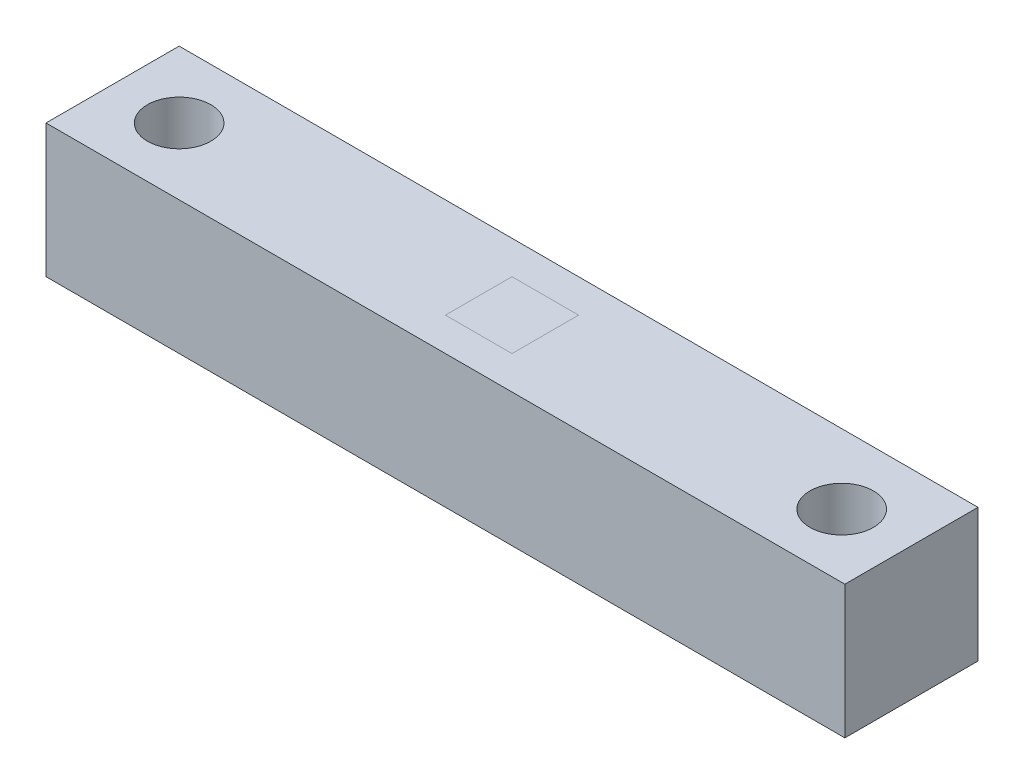
ISO-10303-21;
HEADER;
FILE_DESCRIPTION(('STEP AP214'),'2;1');
FILE_NAME('part.step','',(''),(''),'','','');
FILE_SCHEMA(('AUTOMOTIVE_DESIGN { 1 0 10303 214 1 1 1 1 }'));
ENDSEC;
DATA;
#1=APPLICATION_CONTEXT('core data for automotive mechanical design processes');
#2=APPLICATION_PROTOCOL_DEFINITION('international standard','automotive_design',2000,#1);
#3=PRODUCT_CONTEXT('',#1,'mechanical');
#4=PRODUCT('Part','Part','',(#3));
#5=PRODUCT_RELATED_PRODUCT_CATEGORY('part','',(#4));
#6=PRODUCT_DEFINITION_FORMATION('','',#4);
#7=PRODUCT_DEFINITION_CONTEXT('part definition',#1,'design');
#8=PRODUCT_DEFINITION('design','',#6,#7);
#9=PRODUCT_DEFINITION_SHAPE('','',#8);
#10=(LENGTH_UNIT() NAMED_UNIT(*) SI_UNIT(.MILLI.,.METRE.));
#11=(NAMED_UNIT(*) PLANE_ANGLE_UNIT() SI_UNIT($,.RADIAN.));
#12=(NAMED_UNIT(*) SI_UNIT($,.STERADIAN.) SOLID_ANGLE_UNIT());
#13=UNCERTAINTY_MEASURE_WITH_UNIT(LENGTH_MEASURE(1.E-05),#10,'distance_accuracy_value','');
#14=(GEOMETRIC_REPRESENTATION_CONTEXT(3) GLOBAL_UNCERTAINTY_ASSIGNED_CONTEXT((#13)) GLOBAL_UNIT_ASSIGNED_CONTEXT((#10,
#11,#12)) REPRESENTATION_CONTEXT('',''));
#15=CARTESIAN_POINT('',(0.,0.,0.));
#16=DIRECTION('',(0.,0.,1.));
#17=DIRECTION('',(1.,0.,0.));
#18=AXIS2_PLACEMENT_3D('',#15,#16,#17);
#19=CARTESIAN_POINT('',(120.,20.,40.));
#20=DIRECTION('',(0.,-1.,0.));
#21=DIRECTION('',(1.,0.,0.));
#22=AXIS2_PLACEMENT_3D('',#19,#20,#21);
#23=PLANE('',#22);
#24=DIRECTION('',(-1.,0.,0.));
#25=VECTOR('',#24,1.);
#26=CARTESIAN_POINT('',(120.,20.,0.));
#27=LINE('',#26,#25);
#28=CARTESIAN_POINT('',(120.,20.,0.));
#29=VERTEX_POINT('',#28);
#30=CARTESIAN_POINT('',(-120.,20.,0.));
#31=VERTEX_POINT('',#30);
#32=EDGE_CURVE('E261',#29,#31,#27,.T.);
#33=ORIENTED_EDGE('',*,*,#32,.T.);
#34=DIRECTION('',(0.,0.,-1.));
#35=VECTOR('',#34,1.);
#36=CARTESIAN_POINT('',(-120.,20.,40.));
#37=LINE('',#36,#35);
#38=CARTESIAN_POINT('',(-120.,20.,40.));
#39=VERTEX_POINT('',#38);
#40=EDGE_CURVE('E328',#39,#31,#37,.T.);
#41=ORIENTED_EDGE('',*,*,#40,.F.);
#42=DIRECTION('',(-1.,0.,0.));
#43=VECTOR('',#42,1.);
#44=CARTESIAN_POINT('',(120.,20.,40.));
#45=LINE('',#44,#43);
#46=CARTESIAN_POINT('',(120.,20.,40.));
#47=VERTEX_POINT('',#46);
#48=EDGE_CURVE('E258',#47,#39,#45,.T.);
#49=ORIENTED_EDGE('',*,*,#48,.F.);
#50=DIRECTION('',(0.,0.,-1.));
#51=VECTOR('',#50,1.);
#52=CARTESIAN_POINT('',(120.,20.,40.));
#53=LINE('',#52,#51);
#54=EDGE_CURVE('E272',#47,#29,#53,.T.);
#55=ORIENTED_EDGE('',*,*,#54,.T.);
#56=EDGE_LOOP('',(#33,#41,#49,#55));
#57=FACE_BOUND('',#56,.T.);
#58=CARTESIAN_POINT('',(100.,20.,20.95));
#59=DIRECTION('',(0.,1.,0.));
#60=DIRECTION('',(-1.,0.,0.));
#61=AXIS2_PLACEMENT_3D('',#58,#59,#60);
#62=CIRCLE('',#61,9.52500000000001);
#63=CARTESIAN_POINT('',(90.475,20.,20.95));
#64=VERTEX_POINT('',#63);
#65=EDGE_CURVE('E359',#64,#64,#62,.T.);
#66=ORIENTED_EDGE('',*,*,#65,.F.);
#67=EDGE_LOOP('',(#66));
#68=FACE_BOUND('',#67,.T.);
#69=CARTESIAN_POINT('',(-100.,20.,20.));
#70=DIRECTION('',(0.,1.,0.));
#71=DIRECTION('',(-1.,0.,0.));
#72=AXIS2_PLACEMENT_3D('',#69,#70,#71);
#73=CIRCLE('',#72,9.52500000000001);
#74=CARTESIAN_POINT('',(-109.525,20.,20.));
#75=VERTEX_POINT('',#74);
#76=EDGE_CURVE('E354',#75,#75,#73,.T.);
#77=ORIENTED_EDGE('',*,*,#76,.F.);
#78=EDGE_LOOP('',(#77));
#79=FACE_BOUND('',#78,.T.);
#80=DIRECTION('',(0.,0.,1.));
#81=VECTOR('',#80,1.);
#82=CARTESIAN_POINT('',(-10.,20.,40.));
#83=LINE('',#82,#81);
#84=CARTESIAN_POINT('',(-10.,20.,10.));
#85=VERTEX_POINT('',#84);
#86=CARTESIAN_POINT('',(-9.99999999999998,20.,30.));
#87=VERTEX_POINT('',#86);
#88=EDGE_CURVE('E12',#85,#87,#83,.T.);
#89=ORIENTED_EDGE('',*,*,#88,.F.);
#90=DIRECTION('',(-1.,0.,0.));
#91=VECTOR('',#90,1.);
#92=CARTESIAN_POINT('',(120.,20.,9.99999999999999));
#93=LINE('',#92,#91);
#94=CARTESIAN_POINT('',(10.,20.,10.));
#95=VERTEX_POINT('',#94);
#96=EDGE_CURVE('E266',#95,#85,#93,.T.);
#97=ORIENTED_EDGE('',*,*,#96,.F.);
#98=DIRECTION('',(0.,0.,-1.));
#99=VECTOR('',#98,1.);
#100=CARTESIAN_POINT('',(10.,20.,40.));
#101=LINE('',#100,#99);
#102=CARTESIAN_POINT('',(10.,20.,30.));
#103=VERTEX_POINT('',#102);
#104=EDGE_CURVE('E271',#103,#95,#101,.T.);
#105=ORIENTED_EDGE('',*,*,#104,.F.);
#106=DIRECTION('',(1.,0.,0.));
#107=VECTOR('',#106,1.);
#108=CARTESIAN_POINT('',(120.,20.,30.));
#109=LINE('',#108,#107);
#110=EDGE_CURVE('E200',#87,#103,#109,.T.);
#111=ORIENTED_EDGE('',*,*,#110,.F.);
#112=EDGE_LOOP('',(#89,#97,#105,#111));
#113=FACE_BOUND('',#112,.T.);
#114=ADVANCED_FACE('F190',(#57,#68,#79,#113),#23,.F.);
#115=CARTESIAN_POINT('',(-120.,-20.,40.));
#116=DIRECTION('',(1.,0.,0.));
#117=DIRECTION('',(0.,0.,-1.));
#118=AXIS2_PLACEMENT_3D('',#115,#116,#117);
#119=PLANE('',#118);
#120=DIRECTION('',(0.,-1.,0.));
#121=VECTOR('',#120,1.);
#122=CARTESIAN_POINT('',(-120.,-20.,0.));
#123=LINE('',#122,#121);
#124=CARTESIAN_POINT('',(-120.,-20.,0.));
#125=VERTEX_POINT('',#124);
#126=EDGE_CURVE('E262',#31,#125,#123,.T.);
#127=ORIENTED_EDGE('',*,*,#126,.T.);
#128=DIRECTION('',(0.,0.,-1.));
#129=VECTOR('',#128,1.);
#130=CARTESIAN_POINT('',(-120.,-20.,40.));
#131=LINE('',#130,#129);
#132=CARTESIAN_POINT('',(-120.,-20.,40.));
#133=VERTEX_POINT('',#132);
#134=EDGE_CURVE('E244',#133,#125,#131,.T.);
#135=ORIENTED_EDGE('',*,*,#134,.F.);
#136=DIRECTION('',(0.,-1.,0.));
#137=VECTOR('',#136,1.);
#138=CARTESIAN_POINT('',(-120.,-20.,40.));
#139=LINE('',#138,#137);
#140=EDGE_CURVE('E253',#39,#133,#139,.T.);
#141=ORIENTED_EDGE('',*,*,#140,.F.);
#142=ORIENTED_EDGE('',*,*,#40,.T.);
#143=EDGE_LOOP('',(#127,#135,#141,#142));
#144=FACE_BOUND('',#143,.T.);
#145=ADVANCED_FACE('F192',(#144),#119,.F.);
#146=CARTESIAN_POINT('',(120.,-20.,40.));
#147=DIRECTION('',(0.,1.,0.));
#148=DIRECTION('',(-1.,0.,0.));
#149=AXIS2_PLACEMENT_3D('',#146,#147,#148);
#150=PLANE('',#149);
#151=CARTESIAN_POINT('',(-100.,-20.,20.));
#152=DIRECTION('',(0.,1.,0.));
#153=DIRECTION('',(-1.,0.,0.));
#154=AXIS2_PLACEMENT_3D('',#151,#152,#153);
#155=CIRCLE('',#154,9.52500000000001);
#156=CARTESIAN_POINT('',(-109.525,-20.,20.));
#157=VERTEX_POINT('',#156);
#158=EDGE_CURVE('E343',#157,#157,#155,.T.);
#159=ORIENTED_EDGE('',*,*,#158,.T.);
#160=EDGE_LOOP('',(#159));
#161=FACE_BOUND('',#160,.T.);
#162=CARTESIAN_POINT('',(100.,-20.,20.95));
#163=DIRECTION('',(0.,1.,0.));
#164=DIRECTION('',(-1.,0.,0.));
#165=AXIS2_PLACEMENT_3D('',#162,#163,#164);
#166=CIRCLE('',#165,9.52500000000001);
#167=CARTESIAN_POINT('',(90.475,-20.,20.95));
#168=VERTEX_POINT('',#167);
#169=EDGE_CURVE('E361',#168,#168,#166,.T.);
#170=ORIENTED_EDGE('',*,*,#169,.T.);
#171=EDGE_LOOP('',(#170));
#172=FACE_BOUND('',#171,.T.);
#173=DIRECTION('',(1.,0.,0.));
#174=VECTOR('',#173,1.);
#175=CARTESIAN_POINT('',(120.,-20.,0.));
#176=LINE('',#175,#174);
#177=CARTESIAN_POINT('',(120.,-20.,0.));
#178=VERTEX_POINT('',#177);
#179=EDGE_CURVE('E326',#125,#178,#176,.T.);
#180=ORIENTED_EDGE('',*,*,#179,.T.);
#181=DIRECTION('',(0.,0.,-1.));
#182=VECTOR('',#181,1.);
#183=CARTESIAN_POINT('',(120.,-20.,40.));
#184=LINE('',#183,#182);
#185=CARTESIAN_POINT('',(120.,-20.,40.));
#186=VERTEX_POINT('',#185);
#187=EDGE_CURVE('E246',#186,#178,#184,.T.);
#188=ORIENTED_EDGE('',*,*,#187,.F.);
#189=DIRECTION('',(1.,0.,0.));
#190=VECTOR('',#189,1.);
#191=CARTESIAN_POINT('',(120.,-20.,40.));
#192=LINE('',#191,#190);
#193=EDGE_CURVE('E239',#133,#186,#192,.T.);
#194=ORIENTED_EDGE('',*,*,#193,.F.);
#195=ORIENTED_EDGE('',*,*,#134,.T.);
#196=EDGE_LOOP('',(#180,#188,#194,#195));
#197=FACE_BOUND('',#196,.T.);
#198=ADVANCED_FACE('F241',(#161,#172,#197),#150,.F.);
#199=CARTESIAN_POINT('',(120.,-20.,40.));
#200=DIRECTION('',(-1.,0.,0.));
#201=DIRECTION('',(0.,0.,1.));
#202=AXIS2_PLACEMENT_3D('',#199,#200,#201);
#203=PLANE('',#202);
#204=DIRECTION('',(0.,1.,0.));
#205=VECTOR('',#204,1.);
#206=CARTESIAN_POINT('',(120.,-20.,0.));
#207=LINE('',#206,#205);
#208=EDGE_CURVE('E321',#178,#29,#207,.T.);
#209=ORIENTED_EDGE('',*,*,#208,.T.);
#210=ORIENTED_EDGE('',*,*,#54,.F.);
#211=DIRECTION('',(0.,1.,0.));
#212=VECTOR('',#211,1.);
#213=CARTESIAN_POINT('',(120.,-20.,40.));
#214=LINE('',#213,#212);
#215=EDGE_CURVE('E250',#186,#47,#214,.T.);
#216=ORIENTED_EDGE('',*,*,#215,.F.);
#217=ORIENTED_EDGE('',*,*,#187,.T.);
#218=EDGE_LOOP('',(#209,#210,#216,#217));
#219=FACE_BOUND('',#218,.T.);
#220=ADVANCED_FACE('F306',(#219),#203,.F.);
#221=ORIENTED_EDGE('',*,*,#96,.T.);
#222=ORIENTED_EDGE('',*,*,#88,.T.);
#223=ORIENTED_EDGE('',*,*,#110,.T.);
#224=ORIENTED_EDGE('',*,*,#104,.T.);
#225=EDGE_LOOP('',(#221,#222,#223,#224));
#226=FACE_BOUND('',#225,.T.);
#227=ADVANCED_FACE('F296',(#226),#23,.F.);
#228=CARTESIAN_POINT('',(0.,0.,40.));
#229=DIRECTION('',(0.,0.,1.));
#230=DIRECTION('',(1.,0.,0.));
#231=AXIS2_PLACEMENT_3D('',#228,#229,#230);
#232=PLANE('',#231);
#233=ORIENTED_EDGE('',*,*,#140,.T.);
#234=ORIENTED_EDGE('',*,*,#193,.T.);
#235=ORIENTED_EDGE('',*,*,#215,.T.);
#236=ORIENTED_EDGE('',*,*,#48,.T.);
#237=EDGE_LOOP('',(#233,#234,#235,#236));
#238=FACE_BOUND('',#237,.T.);
#239=ADVANCED_FACE('F255',(#238),#232,.T.);
#240=CARTESIAN_POINT('',(0.,0.,0.));
#241=DIRECTION('',(0.,0.,1.));
#242=DIRECTION('',(1.,0.,0.));
#243=AXIS2_PLACEMENT_3D('',#240,#241,#242);
#244=PLANE('',#243);
#245=ORIENTED_EDGE('',*,*,#126,.F.);
#246=ORIENTED_EDGE('',*,*,#32,.F.);
#247=ORIENTED_EDGE('',*,*,#208,.F.);
#248=ORIENTED_EDGE('',*,*,#179,.F.);
#249=EDGE_LOOP('',(#245,#246,#247,#248));
#250=FACE_BOUND('',#249,.T.);
#251=ADVANCED_FACE('F309',(#250),#244,.F.);
#252=CARTESIAN_POINT('',(100.,-20.,20.95));
#253=DIRECTION('',(0.,1.,0.));
#254=DIRECTION('',(-1.,0.,0.));
#255=AXIS2_PLACEMENT_3D('',#252,#253,#254);
#256=CYLINDRICAL_SURFACE('',#255,9.52500000000001);
#257=ORIENTED_EDGE('',*,*,#169,.F.);
#258=EDGE_LOOP('',(#257));
#259=FACE_BOUND('',#258,.T.);
#260=ORIENTED_EDGE('',*,*,#65,.T.);
#261=EDGE_LOOP('',(#260));
#262=FACE_BOUND('',#261,.T.);
#263=ADVANCED_FACE('F371',(#259,#262),#256,.F.);
#264=CARTESIAN_POINT('',(-100.,-20.,20.));
#265=DIRECTION('',(0.,1.,0.));
#266=DIRECTION('',(-1.,0.,0.));
#267=AXIS2_PLACEMENT_3D('',#264,#265,#266);
#268=CYLINDRICAL_SURFACE('',#267,9.52500000000001);
#269=ORIENTED_EDGE('',*,*,#158,.F.);
#270=EDGE_LOOP('',(#269));
#271=FACE_BOUND('',#270,.T.);
#272=ORIENTED_EDGE('',*,*,#76,.T.);
#273=EDGE_LOOP('',(#272));
#274=FACE_BOUND('',#273,.T.);
#275=ADVANCED_FACE('F372',(#271,#274),#268,.F.);
#276=CLOSED_SHELL('',(#114,#145,#198,#220,#227,#239,#251,#263,#275));
#277=MANIFOLD_SOLID_BREP('B2',#276);
#278=ADVANCED_BREP_SHAPE_REPRESENTATION('',(#18,#277),#14);
#279=SHAPE_DEFINITION_REPRESENTATION(#9,#278);
ENDSEC;
END-ISO-10303-21;
